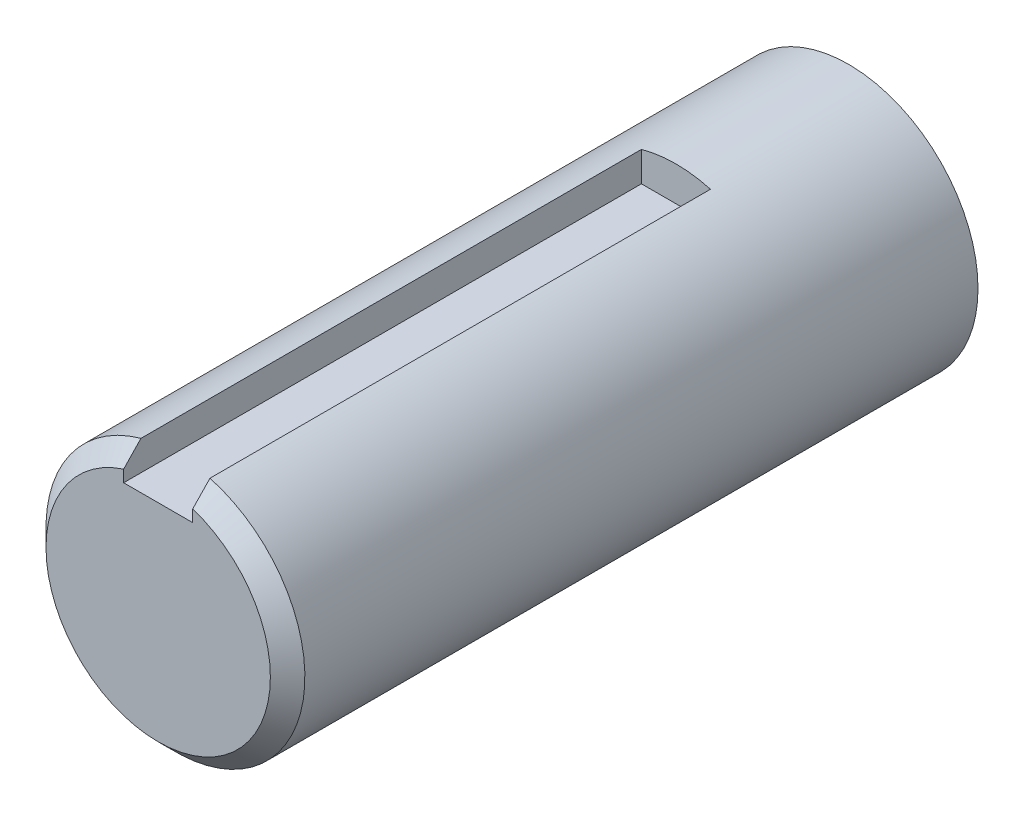
ISO-10303-21;
HEADER;
FILE_DESCRIPTION(('STEP AP214'),'2;1');
FILE_NAME('part.step','',(''),(''),'','','');
FILE_SCHEMA(('AUTOMOTIVE_DESIGN { 1 0 10303 214 1 1 1 1 }'));
ENDSEC;
DATA;
#1=APPLICATION_CONTEXT('core data for automotive mechanical design processes');
#2=APPLICATION_PROTOCOL_DEFINITION('international standard','automotive_design',2000,#1);
#3=PRODUCT_CONTEXT('',#1,'mechanical');
#4=PRODUCT('Part','Part','',(#3));
#5=PRODUCT_RELATED_PRODUCT_CATEGORY('part','',(#4));
#6=PRODUCT_DEFINITION_FORMATION('','',#4);
#7=PRODUCT_DEFINITION_CONTEXT('part definition',#1,'design');
#8=PRODUCT_DEFINITION('design','',#6,#7);
#9=PRODUCT_DEFINITION_SHAPE('','',#8);
#10=(LENGTH_UNIT() NAMED_UNIT(*) SI_UNIT(.MILLI.,.METRE.));
#11=(NAMED_UNIT(*) PLANE_ANGLE_UNIT() SI_UNIT($,.RADIAN.));
#12=(NAMED_UNIT(*) SI_UNIT($,.STERADIAN.) SOLID_ANGLE_UNIT());
#13=UNCERTAINTY_MEASURE_WITH_UNIT(LENGTH_MEASURE(1.E-05),#10,'distance_accuracy_value','');
#14=(GEOMETRIC_REPRESENTATION_CONTEXT(3) GLOBAL_UNCERTAINTY_ASSIGNED_CONTEXT((#13)) GLOBAL_UNIT_ASSIGNED_CONTEXT((#10,
#11,#12)) REPRESENTATION_CONTEXT('',''));
#15=CARTESIAN_POINT('',(0.,0.,0.));
#16=DIRECTION('',(0.,0.,1.));
#17=DIRECTION('',(1.,0.,0.));
#18=AXIS2_PLACEMENT_3D('',#15,#16,#17);
#19=CARTESIAN_POINT('',(0.,0.,40.));
#20=DIRECTION('',(0.,0.,-1.));
#21=DIRECTION('',(-1.,0.,0.));
#22=AXIS2_PLACEMENT_3D('',#19,#20,#21);
#23=CYLINDRICAL_SURFACE('',#22,15.);
#24=DIRECTION('',(0.,0.,1.));
#25=VECTOR('',#24,1.);
#26=CARTESIAN_POINT('',(4.,14.456832294801,-20.));
#27=LINE('',#26,#25);
#28=CARTESIAN_POINT('',(4.,14.456832294801,-20.));
#29=VERTEX_POINT('',#28);
#30=CARTESIAN_POINT('',(4.,14.456832294801,38.));
#31=VERTEX_POINT('',#30);
#32=EDGE_CURVE('E114',#29,#31,#27,.T.);
#33=ORIENTED_EDGE('',*,*,#32,.T.);
#34=CARTESIAN_POINT('',(0.,0.,38.));
#35=DIRECTION('',(0.,0.,1.));
#36=DIRECTION('',(1.,0.,0.));
#37=AXIS2_PLACEMENT_3D('',#34,#35,#36);
#38=CIRCLE('',#37,15.);
#39=CARTESIAN_POINT('',(-4.,14.456832294801,38.));
#40=VERTEX_POINT('',#39);
#41=EDGE_CURVE('E46',#31,#40,#38,.F.);
#42=ORIENTED_EDGE('',*,*,#41,.T.);
#43=DIRECTION('',(0.,0.,1.));
#44=VECTOR('',#43,1.);
#45=CARTESIAN_POINT('',(-4.,14.456832294801,-20.));
#46=LINE('',#45,#44);
#47=CARTESIAN_POINT('',(-4.,14.456832294801,-20.));
#48=VERTEX_POINT('',#47);
#49=EDGE_CURVE('E86',#48,#40,#46,.T.);
#50=ORIENTED_EDGE('',*,*,#49,.F.);
#51=CARTESIAN_POINT('',(0.,0.,-20.));
#52=DIRECTION('',(0.,0.,1.));
#53=DIRECTION('',(1.,0.,0.));
#54=AXIS2_PLACEMENT_3D('',#51,#52,#53);
#55=CIRCLE('',#54,15.);
#56=EDGE_CURVE('E94',#29,#48,#55,.T.);
#57=ORIENTED_EDGE('',*,*,#56,.F.);
#58=EDGE_LOOP('',(#33,#42,#50,#57));
#59=FACE_BOUND('',#58,.T.);
#60=CARTESIAN_POINT('',(0.,0.,-40.));
#61=DIRECTION('',(0.,0.,1.));
#62=DIRECTION('',(1.,0.,0.));
#63=AXIS2_PLACEMENT_3D('',#60,#61,#62);
#64=CIRCLE('',#63,15.);
#65=CARTESIAN_POINT('',(15.,0.,-40.));
#66=VERTEX_POINT('',#65);
#67=EDGE_CURVE('E110',#66,#66,#64,.T.);
#68=ORIENTED_EDGE('',*,*,#67,.T.);
#69=EDGE_LOOP('',(#68));
#70=FACE_BOUND('',#69,.T.);
#71=ADVANCED_FACE('F33',(#59,#70),#23,.T.);
#72=CARTESIAN_POINT('',(0.,0.,40.));
#73=DIRECTION('',(0.,0.,1.));
#74=DIRECTION('',(1.,0.,0.));
#75=AXIS2_PLACEMENT_3D('',#72,#73,#74);
#76=PLANE('',#75);
#77=DIRECTION('',(0.,-1.,0.));
#78=VECTOR('',#77,1.);
#79=CARTESIAN_POINT('',(-4.,14.456832294801,40.));
#80=LINE('',#79,#78);
#81=CARTESIAN_POINT('',(-4.,12.3693168768529,40.));
#82=VERTEX_POINT('',#81);
#83=CARTESIAN_POINT('',(-4.,11.,40.));
#84=VERTEX_POINT('',#83);
#85=EDGE_CURVE('E193',#82,#84,#80,.T.);
#86=ORIENTED_EDGE('',*,*,#85,.F.);
#87=CARTESIAN_POINT('',(0.,0.,40.));
#88=DIRECTION('',(0.,0.,1.));
#89=DIRECTION('',(1.,0.,0.));
#90=AXIS2_PLACEMENT_3D('',#87,#88,#89);
#91=CIRCLE('',#90,13.);
#92=CARTESIAN_POINT('',(4.,12.3693168768529,40.));
#93=VERTEX_POINT('',#92);
#94=EDGE_CURVE('E113',#82,#93,#91,.T.);
#95=ORIENTED_EDGE('',*,*,#94,.T.);
#96=DIRECTION('',(0.,1.,0.));
#97=VECTOR('',#96,1.);
#98=CARTESIAN_POINT('',(4.,11.,40.));
#99=LINE('',#98,#97);
#100=CARTESIAN_POINT('',(4.,11.,40.));
#101=VERTEX_POINT('',#100);
#102=EDGE_CURVE('E101',#101,#93,#99,.T.);
#103=ORIENTED_EDGE('',*,*,#102,.F.);
#104=DIRECTION('',(1.,0.,0.));
#105=VECTOR('',#104,1.);
#106=CARTESIAN_POINT('',(-4.,11.,40.));
#107=LINE('',#106,#105);
#108=EDGE_CURVE('E197',#84,#101,#107,.T.);
#109=ORIENTED_EDGE('',*,*,#108,.F.);
#110=EDGE_LOOP('',(#86,#95,#103,#109));
#111=FACE_BOUND('',#110,.T.);
#112=ADVANCED_FACE('F133',(#111),#76,.T.);
#113=CARTESIAN_POINT('',(0.,0.,-40.));
#114=DIRECTION('',(0.,0.,1.));
#115=DIRECTION('',(1.,0.,0.));
#116=AXIS2_PLACEMENT_3D('',#113,#114,#115);
#117=PLANE('',#116);
#118=ORIENTED_EDGE('',*,*,#67,.F.);
#119=EDGE_LOOP('',(#118));
#120=FACE_BOUND('',#119,.T.);
#121=ADVANCED_FACE('F127',(#120),#117,.F.);
#122=CARTESIAN_POINT('',(4.,11.,-20.));
#123=DIRECTION('',(1.,0.,0.));
#124=DIRECTION('',(0.,1.,0.));
#125=AXIS2_PLACEMENT_3D('',#122,#123,#124);
#126=PLANE('',#125);
#127=ORIENTED_EDGE('',*,*,#102,.T.);
#128=CARTESIAN_POINT('',(4.,12.3693168768529,40.));
#129=CARTESIAN_POINT('',(4.,12.5438497888099,39.833932565845));
#130=CARTESIAN_POINT('',(4.,12.7182183007377,39.6676924866891));
#131=CARTESIAN_POINT('',(4.,13.0666585966125,39.3349025155927));
#132=CARTESIAN_POINT('',(4.,13.2407303813155,39.168352624444));
#133=CARTESIAN_POINT('',(4.,13.58861009732,38.8349777429273));
#134=CARTESIAN_POINT('',(4.,13.7624180287548,38.6681527526985));
#135=CARTESIAN_POINT('',(4.,14.1097966672148,38.3342550704033));
#136=CARTESIAN_POINT('',(4.,14.2833673736341,38.1671823777064));
#137=CARTESIAN_POINT('',(4.,14.456832294801,38.));
#138=B_SPLINE_CURVE_WITH_KNOTS('',3,(#128,#129,#130,#131,#132,#133,#134,#135,#136,#137),
.UNSPECIFIED.,.F.,.F.,(4,2,2,2,4),(0.,0.722745325564517,1.44548880669682,2.16823192227971,
2.89097688089567),.UNSPECIFIED.);
#139=EDGE_CURVE('E60',#93,#31,#138,.T.);
#140=ORIENTED_EDGE('',*,*,#139,.T.);
#141=ORIENTED_EDGE('',*,*,#32,.F.);
#142=DIRECTION('',(0.,1.,0.));
#143=VECTOR('',#142,1.);
#144=CARTESIAN_POINT('',(4.,11.,-20.));
#145=LINE('',#144,#143);
#146=CARTESIAN_POINT('',(4.,11.,-20.));
#147=VERTEX_POINT('',#146);
#148=EDGE_CURVE('E100',#147,#29,#145,.T.);
#149=ORIENTED_EDGE('',*,*,#148,.F.);
#150=DIRECTION('',(0.,0.,1.));
#151=VECTOR('',#150,1.);
#152=CARTESIAN_POINT('',(4.,11.,-20.));
#153=LINE('',#152,#151);
#154=EDGE_CURVE('E105',#147,#101,#153,.T.);
#155=ORIENTED_EDGE('',*,*,#154,.T.);
#156=EDGE_LOOP('',(#127,#140,#141,#149,#155));
#157=FACE_BOUND('',#156,.T.);
#158=ADVANCED_FACE('F121',(#157),#126,.F.);
#159=CARTESIAN_POINT('',(-4.,11.,-20.));
#160=DIRECTION('',(0.,-1.,0.));
#161=DIRECTION('',(0.,0.,-1.));
#162=AXIS2_PLACEMENT_3D('',#159,#160,#161);
#163=PLANE('',#162);
#164=ORIENTED_EDGE('',*,*,#108,.T.);
#165=ORIENTED_EDGE('',*,*,#154,.F.);
#166=DIRECTION('',(1.,0.,0.));
#167=VECTOR('',#166,1.);
#168=CARTESIAN_POINT('',(-4.,11.,-20.));
#169=LINE('',#168,#167);
#170=CARTESIAN_POINT('',(-4.,11.,-20.));
#171=VERTEX_POINT('',#170);
#172=EDGE_CURVE('E93',#171,#147,#169,.T.);
#173=ORIENTED_EDGE('',*,*,#172,.F.);
#174=DIRECTION('',(0.,0.,1.));
#175=VECTOR('',#174,1.);
#176=CARTESIAN_POINT('',(-4.,11.,-20.));
#177=LINE('',#176,#175);
#178=EDGE_CURVE('E89',#171,#84,#177,.T.);
#179=ORIENTED_EDGE('',*,*,#178,.T.);
#180=EDGE_LOOP('',(#164,#165,#173,#179));
#181=FACE_BOUND('',#180,.T.);
#182=ADVANCED_FACE('F126',(#181),#163,.F.);
#183=CARTESIAN_POINT('',(-4.,14.456832294801,-20.));
#184=DIRECTION('',(-1.,0.,0.));
#185=DIRECTION('',(0.,0.,1.));
#186=AXIS2_PLACEMENT_3D('',#183,#184,#185);
#187=PLANE('',#186);
#188=ORIENTED_EDGE('',*,*,#49,.T.);
#189=CARTESIAN_POINT('',(-4.,14.456832294801,38.));
#190=CARTESIAN_POINT('',(-4.,14.2833673736341,38.1671823777064));
#191=CARTESIAN_POINT('',(-4.,14.1097966672148,38.3342550704033));
#192=CARTESIAN_POINT('',(-4.,13.7624180287548,38.6681527526985));
#193=CARTESIAN_POINT('',(-4.,13.58861009732,38.8349777429273));
#194=CARTESIAN_POINT('',(-4.,13.2407303813155,39.168352624444));
#195=CARTESIAN_POINT('',(-4.,13.0666585966125,39.3349025155927));
#196=CARTESIAN_POINT('',(-4.,12.7182183007377,39.6676924866891));
#197=CARTESIAN_POINT('',(-4.,12.5438497888099,39.833932565845));
#198=CARTESIAN_POINT('',(-4.,12.3693168768529,40.));
#199=B_SPLINE_CURVE_WITH_KNOTS('',3,(#189,#190,#191,#192,#193,#194,#195,#196,#197,#198),
.UNSPECIFIED.,.F.,.F.,(4,2,2,2,4),(0.,0.722744958615964,1.44548807419886,2.16823155533116,
2.89097688089568),.UNSPECIFIED.);
#200=EDGE_CURVE('E11',#40,#82,#199,.T.);
#201=ORIENTED_EDGE('',*,*,#200,.T.);
#202=ORIENTED_EDGE('',*,*,#85,.T.);
#203=ORIENTED_EDGE('',*,*,#178,.F.);
#204=DIRECTION('',(0.,-1.,0.));
#205=VECTOR('',#204,1.);
#206=CARTESIAN_POINT('',(-4.,14.456832294801,-20.));
#207=LINE('',#206,#205);
#208=EDGE_CURVE('E83',#48,#171,#207,.T.);
#209=ORIENTED_EDGE('',*,*,#208,.F.);
#210=EDGE_LOOP('',(#188,#201,#202,#203,#209));
#211=FACE_BOUND('',#210,.T.);
#212=ADVANCED_FACE('F85',(#211),#187,.F.);
#213=CARTESIAN_POINT('',(0.,0.,-20.));
#214=DIRECTION('',(0.,0.,1.));
#215=DIRECTION('',(1.,0.,0.));
#216=AXIS2_PLACEMENT_3D('',#213,#214,#215);
#217=PLANE('',#216);
#218=ORIENTED_EDGE('',*,*,#56,.T.);
#219=ORIENTED_EDGE('',*,*,#208,.T.);
#220=ORIENTED_EDGE('',*,*,#172,.T.);
#221=ORIENTED_EDGE('',*,*,#148,.T.);
#222=EDGE_LOOP('',(#218,#219,#220,#221));
#223=FACE_BOUND('',#222,.T.);
#224=ADVANCED_FACE('F98',(#223),#217,.T.);
#225=CARTESIAN_POINT('',(0.,0.,40.));
#226=DIRECTION('',(0.,0.,-1.));
#227=DIRECTION('',(-1.,0.,0.));
#228=AXIS2_PLACEMENT_3D('',#225,#226,#227);
#229=CONICAL_SURFACE('',#228,13.,0.78539816339745);
#230=ORIENTED_EDGE('',*,*,#200,.F.);
#231=ORIENTED_EDGE('',*,*,#41,.F.);
#232=ORIENTED_EDGE('',*,*,#139,.F.);
#233=ORIENTED_EDGE('',*,*,#94,.F.);
#234=EDGE_LOOP('',(#230,#231,#232,#233));
#235=FACE_BOUND('',#234,.T.);
#236=ADVANCED_FACE('F35',(#235),#229,.T.);
#237=CLOSED_SHELL('',(#71,#112,#121,#158,#182,#212,#224,#236));
#238=MANIFOLD_SOLID_BREP('B2',#237);
#239=ADVANCED_BREP_SHAPE_REPRESENTATION('',(#18,#238),#14);
#240=SHAPE_DEFINITION_REPRESENTATION(#9,#239);
ENDSEC;
END-ISO-10303-21;
